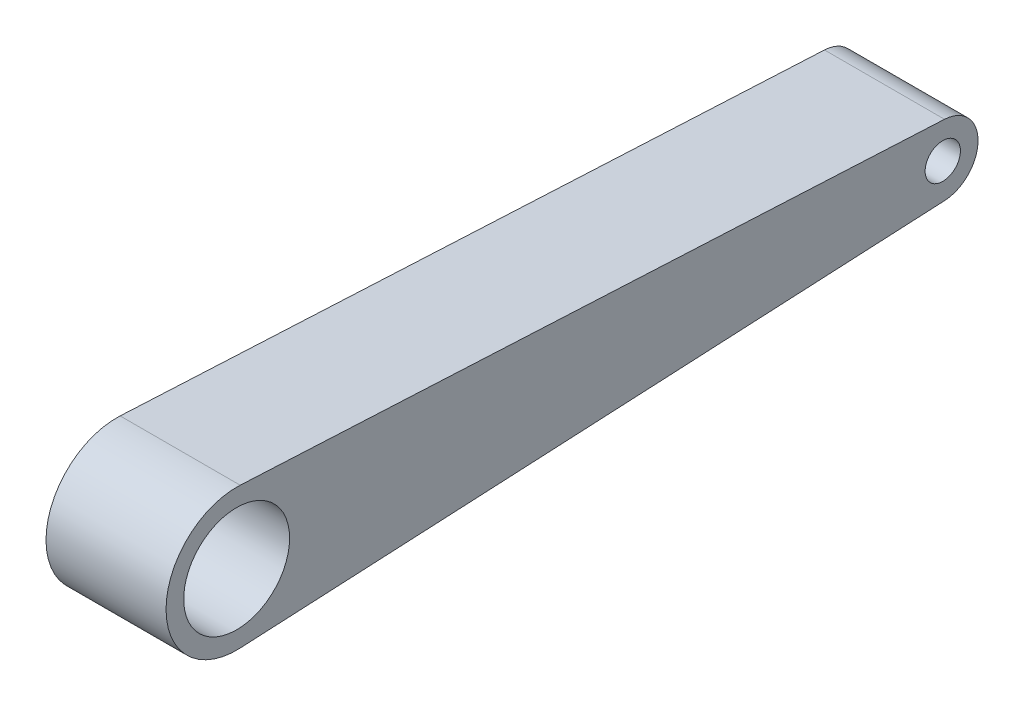
ISO-10303-21;
HEADER;
FILE_DESCRIPTION(('STEP AP214'),'2;1');
FILE_NAME('part.step','',(''),(''),'','','');
FILE_SCHEMA(('AUTOMOTIVE_DESIGN { 1 0 10303 214 1 1 1 1 }'));
ENDSEC;
DATA;
#1=APPLICATION_CONTEXT('core data for automotive mechanical design processes');
#2=APPLICATION_PROTOCOL_DEFINITION('international standard','automotive_design',2000,#1);
#3=PRODUCT_CONTEXT('',#1,'mechanical');
#4=PRODUCT('Part','Part','',(#3));
#5=PRODUCT_RELATED_PRODUCT_CATEGORY('part','',(#4));
#6=PRODUCT_DEFINITION_FORMATION('','',#4);
#7=PRODUCT_DEFINITION_CONTEXT('part definition',#1,'design');
#8=PRODUCT_DEFINITION('design','',#6,#7);
#9=PRODUCT_DEFINITION_SHAPE('','',#8);
#10=(LENGTH_UNIT() NAMED_UNIT(*) SI_UNIT(.MILLI.,.METRE.));
#11=(NAMED_UNIT(*) PLANE_ANGLE_UNIT() SI_UNIT($,.RADIAN.));
#12=(NAMED_UNIT(*) SI_UNIT($,.STERADIAN.) SOLID_ANGLE_UNIT());
#13=UNCERTAINTY_MEASURE_WITH_UNIT(LENGTH_MEASURE(1.E-05),#10,'distance_accuracy_value','');
#14=(GEOMETRIC_REPRESENTATION_CONTEXT(3) GLOBAL_UNCERTAINTY_ASSIGNED_CONTEXT((#13)) GLOBAL_UNIT_ASSIGNED_CONTEXT((#10,
#11,#12)) REPRESENTATION_CONTEXT('',''));
#15=CARTESIAN_POINT('',(0.,0.,0.));
#16=DIRECTION('',(0.,0.,1.));
#17=DIRECTION('',(1.,0.,0.));
#18=AXIS2_PLACEMENT_3D('',#15,#16,#17);
#19=CARTESIAN_POINT('',(34.,0.,200.));
#20=DIRECTION('',(-1.,0.,0.));
#21=DIRECTION('',(0.,0.,1.));
#22=AXIS2_PLACEMENT_3D('',#19,#20,#21);
#23=CYLINDRICAL_SURFACE('',#22,20.);
#24=CARTESIAN_POINT('',(0.,0.,200.));
#25=DIRECTION('',(1.,0.,0.));
#26=DIRECTION('',(0.,0.,-1.));
#27=AXIS2_PLACEMENT_3D('',#24,#25,#26);
#28=CIRCLE('',#27,20.);
#29=CARTESIAN_POINT('',(0.,19.9749843554382,199.));
#30=VERTEX_POINT('',#29);
#31=CARTESIAN_POINT('',(0.,-19.9749843554382,199.));
#32=VERTEX_POINT('',#31);
#33=EDGE_CURVE('E95',#30,#32,#28,.T.);
#34=ORIENTED_EDGE('',*,*,#33,.T.);
#35=DIRECTION('',(-1.,0.,0.));
#36=VECTOR('',#35,1.);
#37=CARTESIAN_POINT('',(34.,-19.9749843554382,199.));
#38=LINE('',#37,#36);
#39=CARTESIAN_POINT('',(34.,-19.9749843554382,199.));
#40=VERTEX_POINT('',#39);
#41=EDGE_CURVE('E11',#40,#32,#38,.T.);
#42=ORIENTED_EDGE('',*,*,#41,.F.);
#43=CARTESIAN_POINT('',(34.,0.,200.));
#44=DIRECTION('',(1.,0.,0.));
#45=DIRECTION('',(0.,0.,-1.));
#46=AXIS2_PLACEMENT_3D('',#43,#44,#45);
#47=CIRCLE('',#46,20.);
#48=CARTESIAN_POINT('',(34.,19.9749843554382,199.));
#49=VERTEX_POINT('',#48);
#50=EDGE_CURVE('E83',#49,#40,#47,.T.);
#51=ORIENTED_EDGE('',*,*,#50,.F.);
#52=DIRECTION('',(-1.,0.,0.));
#53=VECTOR('',#52,1.);
#54=CARTESIAN_POINT('',(34.,19.9749843554382,199.));
#55=LINE('',#54,#53);
#56=EDGE_CURVE('E91',#49,#30,#55,.T.);
#57=ORIENTED_EDGE('',*,*,#56,.T.);
#58=EDGE_LOOP('',(#34,#42,#51,#57));
#59=FACE_BOUND('',#58,.T.);
#60=ADVANCED_FACE('F32',(#59),#23,.T.);
#61=CARTESIAN_POINT('',(34.,-19.9749843554382,199.));
#62=DIRECTION('',(0.,0.998749217771909,0.05));
#63=DIRECTION('',(0.,-0.05,0.998749217771909));
#64=AXIS2_PLACEMENT_3D('',#61,#62,#63);
#65=PLANE('',#64);
#66=DIRECTION('',(0.,0.05,-0.998749217771909));
#67=VECTOR('',#66,1.);
#68=CARTESIAN_POINT('',(0.,-19.9749843554382,199.));
#69=LINE('',#68,#67);
#70=CARTESIAN_POINT('',(0.,-9.98749217771909,-0.499999999999992));
#71=VERTEX_POINT('',#70);
#72=EDGE_CURVE('E87',#32,#71,#69,.T.);
#73=ORIENTED_EDGE('',*,*,#72,.T.);
#74=DIRECTION('',(-1.,0.,0.));
#75=VECTOR('',#74,1.);
#76=CARTESIAN_POINT('',(34.,-9.98749217771909,-0.499999999999992));
#77=LINE('',#76,#75);
#78=CARTESIAN_POINT('',(34.,-9.98749217771909,-0.499999999999992));
#79=VERTEX_POINT('',#78);
#80=EDGE_CURVE('E40',#79,#71,#77,.T.);
#81=ORIENTED_EDGE('',*,*,#80,.F.);
#82=DIRECTION('',(0.,0.05,-0.998749217771909));
#83=VECTOR('',#82,1.);
#84=CARTESIAN_POINT('',(34.,-19.9749843554382,199.));
#85=LINE('',#84,#83);
#86=EDGE_CURVE('E78',#40,#79,#85,.T.);
#87=ORIENTED_EDGE('',*,*,#86,.F.);
#88=ORIENTED_EDGE('',*,*,#41,.T.);
#89=EDGE_LOOP('',(#73,#81,#87,#88));
#90=FACE_BOUND('',#89,.T.);
#91=ADVANCED_FACE('F86',(#90),#65,.F.);
#92=CARTESIAN_POINT('',(34.,0.,0.));
#93=DIRECTION('',(-1.,0.,0.));
#94=DIRECTION('',(0.,0.,1.));
#95=AXIS2_PLACEMENT_3D('',#92,#93,#94);
#96=CYLINDRICAL_SURFACE('',#95,10.);
#97=CARTESIAN_POINT('',(0.,0.,0.));
#98=DIRECTION('',(1.,0.,0.));
#99=DIRECTION('',(0.,0.,-1.));
#100=AXIS2_PLACEMENT_3D('',#97,#98,#99);
#101=CIRCLE('',#100,10.);
#102=CARTESIAN_POINT('',(0.,9.98749217771909,-0.499999999999998));
#103=VERTEX_POINT('',#102);
#104=EDGE_CURVE('E65',#71,#103,#101,.T.);
#105=ORIENTED_EDGE('',*,*,#104,.T.);
#106=DIRECTION('',(-1.,0.,0.));
#107=VECTOR('',#106,1.);
#108=CARTESIAN_POINT('',(34.,9.98749217771909,-0.499999999999998));
#109=LINE('',#108,#107);
#110=CARTESIAN_POINT('',(34.,9.98749217771909,-0.499999999999998));
#111=VERTEX_POINT('',#110);
#112=EDGE_CURVE('E88',#111,#103,#109,.T.);
#113=ORIENTED_EDGE('',*,*,#112,.F.);
#114=CARTESIAN_POINT('',(34.,0.,0.));
#115=DIRECTION('',(1.,0.,0.));
#116=DIRECTION('',(0.,0.,-1.));
#117=AXIS2_PLACEMENT_3D('',#114,#115,#116);
#118=CIRCLE('',#117,10.);
#119=EDGE_CURVE('E81',#79,#111,#118,.T.);
#120=ORIENTED_EDGE('',*,*,#119,.F.);
#121=ORIENTED_EDGE('',*,*,#80,.T.);
#122=EDGE_LOOP('',(#105,#113,#120,#121));
#123=FACE_BOUND('',#122,.T.);
#124=ADVANCED_FACE('F89',(#123),#96,.T.);
#125=CARTESIAN_POINT('',(34.,19.9749843554382,199.));
#126=DIRECTION('',(0.,-0.998749217771909,0.05));
#127=DIRECTION('',(0.,-0.05,-0.998749217771909));
#128=AXIS2_PLACEMENT_3D('',#125,#126,#127);
#129=PLANE('',#128);
#130=DIRECTION('',(0.,0.05,0.998749217771909));
#131=VECTOR('',#130,1.);
#132=CARTESIAN_POINT('',(0.,19.9749843554382,199.));
#133=LINE('',#132,#131);
#134=EDGE_CURVE('E71',#103,#30,#133,.T.);
#135=ORIENTED_EDGE('',*,*,#134,.T.);
#136=ORIENTED_EDGE('',*,*,#56,.F.);
#137=DIRECTION('',(0.,0.05,0.998749217771909));
#138=VECTOR('',#137,1.);
#139=CARTESIAN_POINT('',(34.,19.9749843554382,199.));
#140=LINE('',#139,#138);
#141=EDGE_CURVE('E48',#111,#49,#140,.T.);
#142=ORIENTED_EDGE('',*,*,#141,.F.);
#143=ORIENTED_EDGE('',*,*,#112,.T.);
#144=EDGE_LOOP('',(#135,#136,#142,#143));
#145=FACE_BOUND('',#144,.T.);
#146=ADVANCED_FACE('F103',(#145),#129,.F.);
#147=CARTESIAN_POINT('',(34.,0.,200.));
#148=DIRECTION('',(1.,0.,0.));
#149=DIRECTION('',(0.,0.,-1.));
#150=AXIS2_PLACEMENT_3D('',#147,#148,#149);
#151=PLANE('',#150);
#152=CARTESIAN_POINT('',(34.,0.,0.));
#153=DIRECTION('',(1.,0.,0.));
#154=DIRECTION('',(0.,0.,-1.));
#155=AXIS2_PLACEMENT_3D('',#152,#153,#154);
#156=CIRCLE('',#155,5.);
#157=CARTESIAN_POINT('',(34.,0.,-5.));
#158=VERTEX_POINT('',#157);
#159=EDGE_CURVE('E112',#158,#158,#156,.T.);
#160=ORIENTED_EDGE('',*,*,#159,.F.);
#161=EDGE_LOOP('',(#160));
#162=FACE_BOUND('',#161,.T.);
#163=CARTESIAN_POINT('',(34.,0.,200.));
#164=DIRECTION('',(1.,0.,0.));
#165=DIRECTION('',(0.,0.,-1.));
#166=AXIS2_PLACEMENT_3D('',#163,#164,#165);
#167=CIRCLE('',#166,15.);
#168=CARTESIAN_POINT('',(34.,0.,185.));
#169=VERTEX_POINT('',#168);
#170=EDGE_CURVE('E113',#169,#169,#167,.T.);
#171=ORIENTED_EDGE('',*,*,#170,.F.);
#172=EDGE_LOOP('',(#171));
#173=FACE_BOUND('',#172,.T.);
#174=ORIENTED_EDGE('',*,*,#50,.T.);
#175=ORIENTED_EDGE('',*,*,#86,.T.);
#176=ORIENTED_EDGE('',*,*,#119,.T.);
#177=ORIENTED_EDGE('',*,*,#141,.T.);
#178=EDGE_LOOP('',(#174,#175,#176,#177));
#179=FACE_BOUND('',#178,.T.);
#180=ADVANCED_FACE('F79',(#162,#173,#179),#151,.T.);
#181=CARTESIAN_POINT('',(0.,0.,200.));
#182=DIRECTION('',(1.,0.,0.));
#183=DIRECTION('',(0.,0.,-1.));
#184=AXIS2_PLACEMENT_3D('',#181,#182,#183);
#185=PLANE('',#184);
#186=CARTESIAN_POINT('',(0.,0.,0.));
#187=DIRECTION('',(1.,0.,0.));
#188=DIRECTION('',(0.,0.,-1.));
#189=AXIS2_PLACEMENT_3D('',#186,#187,#188);
#190=CIRCLE('',#189,5.);
#191=CARTESIAN_POINT('',(0.,0.,-5.));
#192=VERTEX_POINT('',#191);
#193=EDGE_CURVE('E98',#192,#192,#190,.F.);
#194=ORIENTED_EDGE('',*,*,#193,.F.);
#195=EDGE_LOOP('',(#194));
#196=FACE_BOUND('',#195,.T.);
#197=CARTESIAN_POINT('',(0.,0.,200.));
#198=DIRECTION('',(1.,0.,0.));
#199=DIRECTION('',(0.,0.,-1.));
#200=AXIS2_PLACEMENT_3D('',#197,#198,#199);
#201=CIRCLE('',#200,15.);
#202=CARTESIAN_POINT('',(0.,0.,185.));
#203=VERTEX_POINT('',#202);
#204=EDGE_CURVE('E109',#203,#203,#201,.F.);
#205=ORIENTED_EDGE('',*,*,#204,.F.);
#206=EDGE_LOOP('',(#205));
#207=FACE_BOUND('',#206,.T.);
#208=ORIENTED_EDGE('',*,*,#33,.F.);
#209=ORIENTED_EDGE('',*,*,#134,.F.);
#210=ORIENTED_EDGE('',*,*,#104,.F.);
#211=ORIENTED_EDGE('',*,*,#72,.F.);
#212=EDGE_LOOP('',(#208,#209,#210,#211));
#213=FACE_BOUND('',#212,.T.);
#214=ADVANCED_FACE('F106',(#196,#207,#213),#185,.F.);
#215=CARTESIAN_POINT('',(-42.4264068711929,0.,200.));
#216=DIRECTION('',(1.,0.,0.));
#217=DIRECTION('',(0.,0.,-1.));
#218=AXIS2_PLACEMENT_3D('',#215,#216,#217);
#219=CYLINDRICAL_SURFACE('',#218,15.);
#220=ORIENTED_EDGE('',*,*,#204,.T.);
#221=EDGE_LOOP('',(#220));
#222=FACE_BOUND('',#221,.T.);
#223=ORIENTED_EDGE('',*,*,#170,.T.);
#224=EDGE_LOOP('',(#223));
#225=FACE_BOUND('',#224,.T.);
#226=ADVANCED_FACE('F128',(#222,#225),#219,.F.);
#227=CARTESIAN_POINT('',(-42.4264068711929,0.,0.));
#228=DIRECTION('',(1.,0.,0.));
#229=DIRECTION('',(0.,0.,-1.));
#230=AXIS2_PLACEMENT_3D('',#227,#228,#229);
#231=CYLINDRICAL_SURFACE('',#230,5.);
#232=ORIENTED_EDGE('',*,*,#193,.T.);
#233=EDGE_LOOP('',(#232));
#234=FACE_BOUND('',#233,.T.);
#235=ORIENTED_EDGE('',*,*,#159,.T.);
#236=EDGE_LOOP('',(#235));
#237=FACE_BOUND('',#236,.T.);
#238=ADVANCED_FACE('F121',(#234,#237),#231,.F.);
#239=CLOSED_SHELL('',(#60,#91,#124,#146,#180,#214,#226,#238));
#240=MANIFOLD_SOLID_BREP('B2',#239);
#241=ADVANCED_BREP_SHAPE_REPRESENTATION('',(#18,#240),#14);
#242=SHAPE_DEFINITION_REPRESENTATION(#9,#241);
ENDSEC;
END-ISO-10303-21;
